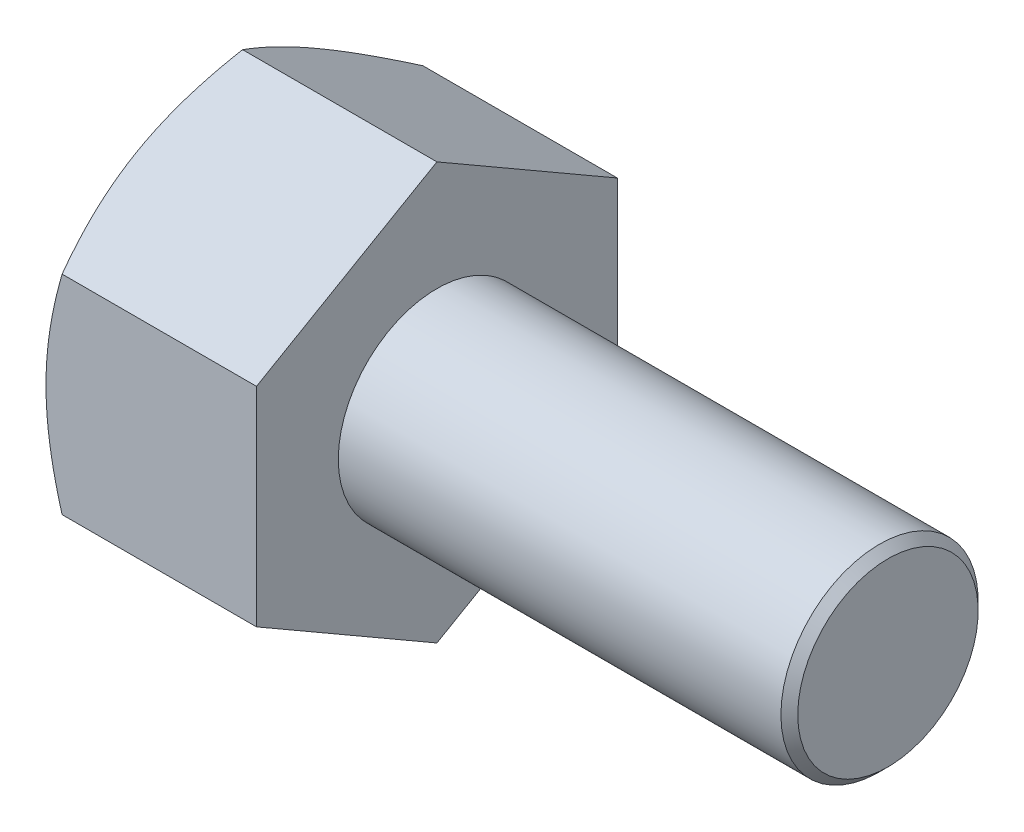
ISO-10303-21;
HEADER;
FILE_DESCRIPTION(('STEP AP214'),'2;1');
FILE_NAME('part.step','',(''),(''),'','','');
FILE_SCHEMA(('AUTOMOTIVE_DESIGN { 1 0 10303 214 1 1 1 1 }'));
ENDSEC;
DATA;
#1=APPLICATION_CONTEXT('core data for automotive mechanical design processes');
#2=APPLICATION_PROTOCOL_DEFINITION('international standard','automotive_design',2000,#1);
#3=PRODUCT_CONTEXT('',#1,'mechanical');
#4=PRODUCT('Part','Part','',(#3));
#5=PRODUCT_RELATED_PRODUCT_CATEGORY('part','',(#4));
#6=PRODUCT_DEFINITION_FORMATION('','',#4);
#7=PRODUCT_DEFINITION_CONTEXT('part definition',#1,'design');
#8=PRODUCT_DEFINITION('design','',#6,#7);
#9=PRODUCT_DEFINITION_SHAPE('','',#8);
#10=(LENGTH_UNIT() NAMED_UNIT(*) SI_UNIT(.MILLI.,.METRE.));
#11=(NAMED_UNIT(*) PLANE_ANGLE_UNIT() SI_UNIT($,.RADIAN.));
#12=(NAMED_UNIT(*) SI_UNIT($,.STERADIAN.) SOLID_ANGLE_UNIT());
#13=UNCERTAINTY_MEASURE_WITH_UNIT(LENGTH_MEASURE(1.E-05),#10,'distance_accuracy_value','');
#14=(GEOMETRIC_REPRESENTATION_CONTEXT(3) GLOBAL_UNCERTAINTY_ASSIGNED_CONTEXT((#13)) GLOBAL_UNIT_ASSIGNED_CONTEXT((#10,
#11,#12)) REPRESENTATION_CONTEXT('',''));
#15=CARTESIAN_POINT('',(0.,0.,0.));
#16=DIRECTION('',(0.,0.,1.));
#17=DIRECTION('',(1.,0.,0.));
#18=AXIS2_PLACEMENT_3D('',#15,#16,#17);
#19=CARTESIAN_POINT('',(17.78,8.79881810244989,-15.24));
#20=DIRECTION('',(0.,-0.866025403784438,0.500000000000001));
#21=DIRECTION('',(0.,-0.500000000000001,-0.866025403784438));
#22=AXIS2_PLACEMENT_3D('',#19,#20,#21);
#23=PLANE('',#22);
#24=CARTESIAN_POINT('',(1.36124856487293,17.5977516749536,0.00019999999999964));
#25=CARTESIAN_POINT('',(1.24959951580787,17.4043571270071,-0.334769182950277));
#26=CARTESIAN_POINT('',(1.14301689339764,17.2102082364175,-0.67104492568457));
#27=CARTESIAN_POINT('',(0.941392794274875,16.8203536097317,-1.34629294667019));
#28=CARTESIAN_POINT('',(0.846355113416604,16.6246473840139,-1.68526607297097));
#29=CARTESIAN_POINT('',(0.66909840053516,16.2312998636243,-2.366563963317));
#30=CARTESIAN_POINT('',(0.586909697644726,16.0336551269014,-2.70889468916957));
#31=CARTESIAN_POINT('',(0.437115772865838,15.6369922624283,-3.39593492391281));
#32=CARTESIAN_POINT('',(0.369509719007362,15.4379742136972,-3.74064429593826));
#33=CARTESIAN_POINT('',(0.251756608946902,15.0436643229984,-4.42360906055556));
#34=CARTESIAN_POINT('',(0.201219810608037,14.8484017549047,-4.76181374931027));
#35=CARTESIAN_POINT('',(0.116480799136285,14.456981889209,-5.43977284378687));
#36=CARTESIAN_POINT('',(0.0822789004151911,14.2608245744585,-5.77952727921101));
#37=CARTESIAN_POINT('',(0.031073266351231,13.8681804292977,-6.45960688792405));
#38=CARTESIAN_POINT('',(0.0140490943081159,13.6716942696884,-6.79993089935137));
#39=CARTESIAN_POINT('',(-0.00243496934619382,13.2785405765824,-7.48089307099431));
#40=CARTESIAN_POINT('',(-0.00189540367909207,13.0818730488777,-7.82153122117776));
#41=CARTESIAN_POINT('',(0.0155211376957889,12.7142046937736,-8.45835149255341));
#42=CARTESIAN_POINT('',(0.030273714378812,12.5431776644535,-8.75457899680348));
#43=CARTESIAN_POINT('',(0.0727834716971236,12.2015170081387,-9.34635261248803));
#44=CARTESIAN_POINT('',(0.100541572179044,12.0308834098283,-9.64189867423982));
#45=CARTESIAN_POINT('',(0.168578399449137,11.6901022976449,-10.2321488748013));
#46=CARTESIAN_POINT('',(0.208867467112933,11.5199553027916,-10.5268521146425));
#47=CARTESIAN_POINT('',(0.301259369306836,11.180458992243,-11.1148769734947));
#48=CARTESIAN_POINT('',(0.353363006957712,11.0111097315748,-11.4081984971963));
#49=CARTESIAN_POINT('',(0.528712881623148,10.4970406660827,-12.2985922372281));
#50=CARTESIAN_POINT('',(0.66944328143029,10.1538095162329,-12.8930860275082));
#51=CARTESIAN_POINT('',(0.988843664620513,9.47246519221091,-14.073209014163));
#52=CARTESIAN_POINT('',(1.16743863641809,9.13434329464646,-14.6588533198962));
#53=CARTESIAN_POINT('',(1.36124856487292,8.79870263239605,-15.2402));
#54=B_SPLINE_CURVE_WITH_KNOTS('',3,(#24,#25,#26,#27,#28,#29,#30,#31,#32,#33,#34,#35,#36,#37,#38,
#39,#40,#41,#42,#43,#44,#45,#46,#47,#48,#49,#50,#51,#52,#53),.UNSPECIFIED.,.F.,.F.,(4,2,2,2,2,2,
2,2,2,2,2,2,2,2,4),(0.,1.20777405446518,2.41594414355609,3.62692432470835,4.83783539867415,
6.01885835042782,7.19990403342507,8.37954293904845,9.55914539371592,10.5860139737634,
11.6129551925018,12.6407461281185,13.6686069509877,15.7695293702068,17.8663280118345),.UNSPECIFIED.);
#55=CARTESIAN_POINT('',(1.3611818975501,17.5976362048998,0.));
#56=VERTEX_POINT('',#55);
#57=CARTESIAN_POINT('',(0.,13.1982271536748,-7.62000000000002));
#58=VERTEX_POINT('',#57);
#59=EDGE_CURVE('E56',#56,#58,#54,.T.);
#60=ORIENTED_EDGE('',*,*,#59,.F.);
#61=DIRECTION('',(-1.,0.,0.));
#62=VECTOR('',#61,1.);
#63=CARTESIAN_POINT('',(17.78,17.5976362048998,0.));
#64=LINE('',#63,#62);
#65=CARTESIAN_POINT('',(17.78,17.5976362048998,0.));
#66=VERTEX_POINT('',#65);
#67=EDGE_CURVE('E159',#66,#56,#64,.T.);
#68=ORIENTED_EDGE('',*,*,#67,.F.);
#69=DIRECTION('',(0.,0.500000000000001,0.866025403784438));
#70=VECTOR('',#69,1.);
#71=CARTESIAN_POINT('',(17.78,8.79881810244989,-15.24));
#72=LINE('',#71,#70);
#73=CARTESIAN_POINT('',(17.78,8.79881810244989,-15.24));
#74=VERTEX_POINT('',#73);
#75=EDGE_CURVE('E267',#74,#66,#72,.T.);
#76=ORIENTED_EDGE('',*,*,#75,.F.);
#77=DIRECTION('',(-1.,0.,0.));
#78=VECTOR('',#77,1.);
#79=CARTESIAN_POINT('',(17.78,8.79881810244989,-15.24));
#80=LINE('',#79,#78);
#81=CARTESIAN_POINT('',(1.36118189755009,8.79881810244989,-15.24));
#82=VERTEX_POINT('',#81);
#83=EDGE_CURVE('E143',#74,#82,#80,.T.);
#84=ORIENTED_EDGE('',*,*,#83,.T.);
#85=EDGE_CURVE('E136',#58,#82,#54,.T.);
#86=ORIENTED_EDGE('',*,*,#85,.F.);
#87=EDGE_LOOP('',(#60,#68,#76,#84,#86));
#88=FACE_BOUND('',#87,.T.);
#89=ADVANCED_FACE('F39',(#88),#23,.F.);
#90=CARTESIAN_POINT('',(17.78,17.5976362048998,0.));
#91=DIRECTION('',(0.,-0.866025403784438,-0.500000000000001));
#92=DIRECTION('',(0.,0.500000000000001,-0.866025403784438));
#93=AXIS2_PLACEMENT_3D('',#90,#91,#92);
#94=PLANE('',#93);
#95=CARTESIAN_POINT('',(1.36124856487292,8.79870263239605,15.2402));
#96=CARTESIAN_POINT('',(1.24959951580786,8.99209718034262,14.9052308170497));
#97=CARTESIAN_POINT('',(1.14301689339763,9.18624607093221,14.5689550743154));
#98=CARTESIAN_POINT('',(0.941392794274865,9.57610069761802,13.8937070533298));
#99=CARTESIAN_POINT('',(0.846355113416594,9.77180692333583,13.554733927029));
#100=CARTESIAN_POINT('',(0.669098400535152,10.1651544437254,12.873436036683));
#101=CARTESIAN_POINT('',(0.586909697644719,10.3627991804483,12.5311053108304));
#102=CARTESIAN_POINT('',(0.437115772865832,10.7594620449214,11.8440650760872));
#103=CARTESIAN_POINT('',(0.369509719007355,10.9584800936525,11.4993557040617));
#104=CARTESIAN_POINT('',(0.251756608946896,11.3527899843513,10.8163909394444));
#105=CARTESIAN_POINT('',(0.201219810608032,11.548052552445,10.4781862506897));
#106=CARTESIAN_POINT('',(0.116480799136281,11.9394724181407,9.80022715621313));
#107=CARTESIAN_POINT('',(0.0822789004151884,12.1356297328912,9.46047272078899));
#108=CARTESIAN_POINT('',(0.0310732663512296,12.528273878052,8.78039311207595));
#109=CARTESIAN_POINT('',(0.0140490943081152,12.7247600376613,8.44006910064864));
#110=CARTESIAN_POINT('',(-0.00243496934619321,13.1179137307673,7.75910692900569));
#111=CARTESIAN_POINT('',(-0.0018954036790909,13.3145812584719,7.41846877882224));
#112=CARTESIAN_POINT('',(0.0155211376957912,13.6822496135761,6.78164850744659));
#113=CARTESIAN_POINT('',(0.0302737143788149,13.8532766428962,6.48542100319652));
#114=CARTESIAN_POINT('',(0.0727834716971268,14.194937299211,5.89364738751197));
#115=CARTESIAN_POINT('',(0.100541572179047,14.3655708975214,5.59810132576018));
#116=CARTESIAN_POINT('',(0.168578399449141,14.7063520097047,5.00785112519872));
#117=CARTESIAN_POINT('',(0.208867467112937,14.8764990045581,4.71314788535752));
#118=CARTESIAN_POINT('',(0.30125936930684,15.2159953151066,4.1251230265053));
#119=CARTESIAN_POINT('',(0.353363006957718,15.3853445757749,3.8318015028037));
#120=CARTESIAN_POINT('',(0.528712881623156,15.899413641267,2.94140776277185));
#121=CARTESIAN_POINT('',(0.669443281430297,16.2426447911167,2.34691397249184));
#122=CARTESIAN_POINT('',(0.988843664620521,16.9239891151388,1.16679098583701));
#123=CARTESIAN_POINT('',(1.1674386364181,17.2621110127032,0.581146680103786));
#124=CARTESIAN_POINT('',(1.36124856487293,17.5977516749536,-0.000199999999999774));
#125=B_SPLINE_CURVE_WITH_KNOTS('',3,(#95,#96,#97,#98,#99,#100,#101,#102,#103,#104,#105,#106,
#107,#108,#109,#110,#111,#112,#113,#114,#115,#116,#117,#118,#119,#120,#121,#122,#123,#124),
.UNSPECIFIED.,.F.,.F.,(4,2,2,2,2,2,2,2,2,2,2,2,2,2,4),(0.,1.20777405446517,2.41594414355609,
3.62692432470835,4.83783539867414,6.01885835042781,7.19990403342506,8.37954293904844,
9.55914539371591,10.5860139737634,11.6129551925018,12.6407461281185,13.6686069509877,
15.7695293702068,17.8663280118345),.UNSPECIFIED.);
#126=CARTESIAN_POINT('',(1.36118189755009,8.79881810244989,15.24));
#127=VERTEX_POINT('',#126);
#128=CARTESIAN_POINT('',(0.,13.1982271536748,7.62000000000002));
#129=VERTEX_POINT('',#128);
#130=EDGE_CURVE('E63',#127,#129,#125,.T.);
#131=ORIENTED_EDGE('',*,*,#130,.F.);
#132=DIRECTION('',(-1.,0.,0.));
#133=VECTOR('',#132,1.);
#134=CARTESIAN_POINT('',(17.78,8.79881810244989,15.24));
#135=LINE('',#134,#133);
#136=CARTESIAN_POINT('',(17.78,8.79881810244989,15.24));
#137=VERTEX_POINT('',#136);
#138=EDGE_CURVE('E156',#137,#127,#135,.T.);
#139=ORIENTED_EDGE('',*,*,#138,.F.);
#140=DIRECTION('',(0.,-0.500000000000001,0.866025403784438));
#141=VECTOR('',#140,1.);
#142=CARTESIAN_POINT('',(17.78,17.5976362048998,0.));
#143=LINE('',#142,#141);
#144=EDGE_CURVE('E264',#66,#137,#143,.T.);
#145=ORIENTED_EDGE('',*,*,#144,.F.);
#146=ORIENTED_EDGE('',*,*,#67,.T.);
#147=EDGE_CURVE('E179',#129,#56,#125,.T.);
#148=ORIENTED_EDGE('',*,*,#147,.F.);
#149=EDGE_LOOP('',(#131,#139,#145,#146,#148));
#150=FACE_BOUND('',#149,.T.);
#151=ADVANCED_FACE('F186',(#150),#94,.F.);
#152=CARTESIAN_POINT('',(17.78,8.79881810244989,15.24));
#153=DIRECTION('',(0.,0.,-1.));
#154=DIRECTION('',(0.,1.,0.));
#155=AXIS2_PLACEMENT_3D('',#152,#153,#154);
#156=PLANE('',#155);
#157=CARTESIAN_POINT('',(7.54121583573932,-23.8481137053548,15.24));
#158=CARTESIAN_POINT('',(7.37887246797034,-23.5144083613289,15.24));
#159=CARTESIAN_POINT('',(7.21732262208858,-23.180317159734,15.24));
#160=CARTESIAN_POINT('',(6.89598927401056,-22.5112825977046,15.24));
#161=CARTESIAN_POINT('',(6.73620578893311,-22.1763392290498,15.24));
#162=CARTESIAN_POINT('',(6.25973307750529,-21.1700239219223,15.24));
#163=CARTESIAN_POINT('',(5.94596815850462,-20.497262238917,15.24));
#164=CARTESIAN_POINT('',(5.32644959576107,-19.1437474879311,15.24));
#165=CARTESIAN_POINT('',(5.02074704983542,-18.4629709769752,15.24));
#166=CARTESIAN_POINT('',(4.42156492765915,-17.0960784076018,15.24));
#167=CARTESIAN_POINT('',(4.12808478804654,-16.4099625970202,15.24));
#168=CARTESIAN_POINT('',(3.54704523898309,-15.0083124648695,15.24));
#169=CARTESIAN_POINT('',(3.26000943032597,-14.2925599758653,15.24));
#170=CARTESIAN_POINT('',(2.70714829791309,-12.8527552619921,15.24));
#171=CARTESIAN_POINT('',(2.44132532472564,-12.128702127477,15.24));
#172=CARTESIAN_POINT('',(1.93771678665587,-10.6724550903116,15.24));
#173=CARTESIAN_POINT('',(1.69987625136169,-9.94028034858989,15.24));
#174=CARTESIAN_POINT('',(1.2597088092994,-8.46536114413835,15.24));
#175=CARTESIAN_POINT('',(1.0573709395248,-7.72262002110246,15.24));
#176=CARTESIAN_POINT('',(0.788265120211822,-6.60251145275184,15.24));
#177=CARTESIAN_POINT('',(0.704485701554928,-6.22920763746195,15.24));
#178=CARTESIAN_POINT('',(0.5493695172405,-5.48001038480869,15.24));
#179=CARTESIAN_POINT('',(0.478032506653924,-5.10411699857253,15.24));
#180=CARTESIAN_POINT('',(0.34904671613382,-4.34998348746228,15.24));
#181=CARTESIAN_POINT('',(0.291397710657888,-3.97174340136104,15.24));
#182=CARTESIAN_POINT('',(0.190929921580547,-3.21330197496525,15.24));
#183=CARTESIAN_POINT('',(0.148110480949931,-2.83310072231856,15.24));
#184=CARTESIAN_POINT('',(0.0787010348745647,-2.07632239771864,15.24));
#185=CARTESIAN_POINT('',(0.0519022545093188,-1.69976459244319,15.24));
#186=CARTESIAN_POINT('',(0.0142634422864696,-0.945853079765706,15.24));
#187=CARTESIAN_POINT('',(0.00342313962182331,-0.568499385978319,15.24));
#188=CARTESIAN_POINT('',(-0.0020399151946333,0.186328453514729,15.24));
#189=CARTESIAN_POINT('',(0.00333733990572469,0.563802599274178,15.24));
#190=CARTESIAN_POINT('',(0.0301756956455167,1.31818322002531,15.24));
#191=CARTESIAN_POINT('',(0.0516375130110782,1.69508966897055,15.24));
#192=CARTESIAN_POINT('',(0.121584644764654,2.59452960272929,15.24));
#193=CARTESIAN_POINT('',(0.177346341925567,3.11650761866056,15.24));
#194=CARTESIAN_POINT('',(0.316732111548602,4.15673223150258,15.24));
#195=CARTESIAN_POINT('',(0.400359795925729,4.67497833579208,15.24));
#196=CARTESIAN_POINT('',(0.592502959516718,5.70719653896196,15.24));
#197=CARTESIAN_POINT('',(0.701037189567416,6.22116511387602,15.24));
#198=CARTESIAN_POINT('',(0.939669674095968,7.24401710058536,15.24));
#199=CARTESIAN_POINT('',(1.06976765302189,7.75290057727237,15.24));
#200=CARTESIAN_POINT('',(1.35146290146942,8.77691433743718,15.24));
#201=CARTESIAN_POINT('',(1.50347636662908,9.29192932869866,15.24));
#202=CARTESIAN_POINT('',(1.82364284043521,10.3168892781136,15.24));
#203=CARTESIAN_POINT('',(1.99179595904239,10.8268342016982,15.24));
#204=CARTESIAN_POINT('',(2.34153412662749,11.841898610664,15.24));
#205=CARTESIAN_POINT('',(2.52311501083238,12.3470195378328,15.24));
#206=CARTESIAN_POINT('',(2.89753010138246,13.3530470845144,15.24));
#207=CARTESIAN_POINT('',(3.09036415351943,13.8539537616698,15.24));
#208=CARTESIAN_POINT('',(3.57044995778618,15.0668269180235,15.24));
#209=CARTESIAN_POINT('',(3.86261812552224,15.7768447896344,15.24));
#210=CARTESIAN_POINT('',(4.46193396306996,17.1905502809558,15.24));
#211=CARTESIAN_POINT('',(4.76908270405866,17.8942374437191,15.24));
#212=CARTESIAN_POINT('',(5.39525783492977,19.2965094990752,15.24));
#213=CARTESIAN_POINT('',(5.71428726322006,19.9950930310443,15.24));
#214=CARTESIAN_POINT('',(6.36174140812544,21.3878595167043,15.24));
#215=CARTESIAN_POINT('',(6.69016588950687,22.0820425800434,15.24));
#216=CARTESIAN_POINT('',(7.35499962947057,23.4676039923026,15.24));
#217=CARTESIAN_POINT('',(7.69141809141598,24.1589779170415,15.24));
#218=CARTESIAN_POINT('',(8.37045229647266,25.5386754703128,15.24));
#219=CARTESIAN_POINT('',(8.71306807087436,26.2269990834224,15.24));
#220=CARTESIAN_POINT('',(9.40335310855801,27.6009795574379,15.24));
#221=CARTESIAN_POINT('',(9.75102162993734,28.2866367914811,15.24));
#222=CARTESIAN_POINT('',(10.4506083138602,29.6557756897151,15.24));
#223=CARTESIAN_POINT('',(10.8025264673147,30.339257358555,15.24));
#224=CARTESIAN_POINT('',(11.8011764354871,32.2664530938687,15.24));
#225=CARTESIAN_POINT('',(12.452039448593,33.5080262896687,15.24));
#226=CARTESIAN_POINT('',(13.7625426878557,35.986585213138,15.24));
#227=CARTESIAN_POINT('',(14.4221832705418,37.2235707518392,15.24));
#228=CARTESIAN_POINT('',(15.7463446552268,39.6905951022976,15.24));
#229=CARTESIAN_POINT('',(16.4108473177063,40.92064365705,15.24));
#230=CARTESIAN_POINT('',(17.4114657937587,42.7635678932465,15.24));
#231=CARTESIAN_POINT('',(17.7456393831214,43.3774996694961,15.24));
#232=CARTESIAN_POINT('',(18.4151445234397,44.6047303468053,15.24));
#233=CARTESIAN_POINT('',(18.7504760726285,45.2180292488287,15.24));
#234=CARTESIAN_POINT('',(19.0863187869814,45.8310481881768,15.24));
#235=B_SPLINE_CURVE_WITH_KNOTS('',3,(#157,#158,#159,#160,#161,#162,#163,#164,#165,#166,#167,
#168,#169,#170,#171,#172,#173,#174,#175,#176,#177,#178,#179,#180,#181,#182,#183,#184,#185,#186,
#187,#188,#189,#190,#191,#192,#193,#194,#195,#196,#197,#198,#199,#200,#201,#202,#203,#204,#205,
#206,#207,#208,#209,#210,#211,#212,#213,#214,#215,#216,#217,#218,#219,#220,#221,#222,#223,#224,
#225,#226,#227,#228,#229,#230,#231,#232,#233,#234),.UNSPECIFIED.,.F.,.F.,(4,2,2,2,2,2,2,2,2,2,2,
2,2,2,2,2,2,2,2,2,2,2,2,2,2,2,2,2,2,2,2,2,2,2,2,2,2,2,4),(0.,1.11329568908611,2.22660215830832,
4.45353370326716,6.69223347834671,8.93082995156327,11.2440598398532,13.5575456994096,
15.8664081133143,18.1745563050313,19.3221510328774,20.469723167749,21.6172763923309,
22.7647787676481,23.896981507063,25.0291650333665,26.16134906596,27.2935835515353,
28.8675614531263,30.4417434489498,32.0171144748588,33.5924653714722,35.203093019626,
36.8137316418887,38.4238727849191,40.0339918684987,42.3370967676368,44.6403665910571,
46.9442295613245,49.2480348977971,51.5546350905218,53.8612469326,56.1675234461138,
58.473795027921,62.6792307575688,66.8848378291129,71.0790130806454,73.1759761416794,
75.2729360044805),.UNSPECIFIED.);
#236=CARTESIAN_POINT('',(1.36118189755009,-8.7988181024499,15.24));
#237=VERTEX_POINT('',#236);
#238=CARTESIAN_POINT('',(0.,0.,15.24));
#239=VERTEX_POINT('',#238);
#240=EDGE_CURVE('E281',#237,#239,#235,.T.);
#241=ORIENTED_EDGE('',*,*,#240,.F.);
#242=DIRECTION('',(-1.,0.,0.));
#243=VECTOR('',#242,1.);
#244=CARTESIAN_POINT('',(17.78,-8.7988181024499,15.24));
#245=LINE('',#244,#243);
#246=CARTESIAN_POINT('',(17.78,-8.7988181024499,15.24));
#247=VERTEX_POINT('',#246);
#248=EDGE_CURVE('E147',#247,#237,#245,.T.);
#249=ORIENTED_EDGE('',*,*,#248,.F.);
#250=DIRECTION('',(0.,-1.,0.));
#251=VECTOR('',#250,1.);
#252=CARTESIAN_POINT('',(17.78,8.79881810244989,15.24));
#253=LINE('',#252,#251);
#254=EDGE_CURVE('E259',#137,#247,#253,.T.);
#255=ORIENTED_EDGE('',*,*,#254,.F.);
#256=ORIENTED_EDGE('',*,*,#138,.T.);
#257=EDGE_CURVE('E207',#239,#127,#235,.T.);
#258=ORIENTED_EDGE('',*,*,#257,.F.);
#259=EDGE_LOOP('',(#241,#249,#255,#256,#258));
#260=FACE_BOUND('',#259,.T.);
#261=ADVANCED_FACE('F290',(#260),#156,.F.);
#262=CARTESIAN_POINT('',(17.78,-17.5976362048998,0.));
#263=DIRECTION('',(0.,0.866025403784438,-0.500000000000001));
#264=DIRECTION('',(0.,0.500000000000001,0.866025403784438));
#265=AXIS2_PLACEMENT_3D('',#262,#263,#264);
#266=PLANE('',#265);
#267=CARTESIAN_POINT('',(1.36124856487294,-17.5977516749537,-0.000199999999999888));
#268=CARTESIAN_POINT('',(1.24959951580788,-17.4043571270071,0.334769182950276));
#269=CARTESIAN_POINT('',(1.14301689339765,-17.2102082364175,0.67104492568457));
#270=CARTESIAN_POINT('',(0.941392794274882,-16.8203536097317,1.34629294667019));
#271=CARTESIAN_POINT('',(0.846355113416611,-16.6246473840139,1.68526607297097));
#272=CARTESIAN_POINT('',(0.669098400535167,-16.2312998636243,2.366563963317));
#273=CARTESIAN_POINT('',(0.586909697644733,-16.0336551269014,2.70889468916957));
#274=CARTESIAN_POINT('',(0.437115772865845,-15.6369922624283,3.39593492391281));
#275=CARTESIAN_POINT('',(0.369509719007368,-15.4379742136972,3.74064429593826));
#276=CARTESIAN_POINT('',(0.251756608946908,-15.0436643229984,4.42360906055557));
#277=CARTESIAN_POINT('',(0.201219810608043,-14.8484017549047,4.76181374931027));
#278=CARTESIAN_POINT('',(0.116480799136291,-14.456981889209,5.43977284378688));
#279=CARTESIAN_POINT('',(0.0822789004151981,-14.2608245744585,5.77952727921101));
#280=CARTESIAN_POINT('',(0.0310732663512384,-13.8681804292977,6.45960688792405));
#281=CARTESIAN_POINT('',(0.0140490943081236,-13.6716942696884,6.79993089935137));
#282=CARTESIAN_POINT('',(-0.002434969346186,-13.2785405765824,7.48089307099432));
#283=CARTESIAN_POINT('',(-0.00189540367908434,-13.0818730488778,7.82153122117777));
#284=CARTESIAN_POINT('',(0.0155211376957962,-12.7142046937736,8.45835149255342));
#285=CARTESIAN_POINT('',(0.0302737143788189,-12.5431776644535,8.75457899680349));
#286=CARTESIAN_POINT('',(0.0727834716971303,-12.2015170081387,9.34635261248804));
#287=CARTESIAN_POINT('',(0.100541572179051,-12.0308834098283,9.64189867423982));
#288=CARTESIAN_POINT('',(0.168578399449144,-11.690102297645,10.2321488748013));
#289=CARTESIAN_POINT('',(0.208867467112939,-11.5199553027916,10.5268521146425));
#290=CARTESIAN_POINT('',(0.301259369306841,-11.1804589922431,11.1148769734947));
#291=CARTESIAN_POINT('',(0.353363006957718,-11.0111097315748,11.4081984971963));
#292=CARTESIAN_POINT('',(0.528712881623154,-10.4970406660827,12.2985922372281));
#293=CARTESIAN_POINT('',(0.669443281430294,-10.153809516233,12.8930860275082));
#294=CARTESIAN_POINT('',(0.988843664620515,-9.47246519221093,14.073209014163));
#295=CARTESIAN_POINT('',(1.16743863641809,-9.13434329464648,14.6588533198962));
#296=CARTESIAN_POINT('',(1.36124856487292,-8.79870263239606,15.2402));
#297=B_SPLINE_CURVE_WITH_KNOTS('',3,(#267,#268,#269,#270,#271,#272,#273,#274,#275,#276,#277,
#278,#279,#280,#281,#282,#283,#284,#285,#286,#287,#288,#289,#290,#291,#292,#293,#294,#295,#296),
.UNSPECIFIED.,.F.,.F.,(4,2,2,2,2,2,2,2,2,2,2,2,2,2,4),(0.,1.20777405446518,2.4159441435561,
3.62692432470835,4.83783539867415,6.01885835042783,7.19990403342508,8.37954293904845,
9.55914539371593,10.5860139737634,11.6129551925018,12.6407461281185,13.6686069509877,
15.7695293702068,17.8663280118345),.UNSPECIFIED.);
#298=CARTESIAN_POINT('',(1.36118189755011,-17.5976362048998,0.));
#299=VERTEX_POINT('',#298);
#300=CARTESIAN_POINT('',(0.,-13.1982271536748,7.62000000000002));
#301=VERTEX_POINT('',#300);
#302=EDGE_CURVE('E189',#299,#301,#297,.T.);
#303=ORIENTED_EDGE('',*,*,#302,.F.);
#304=DIRECTION('',(-1.,0.,0.));
#305=VECTOR('',#304,1.);
#306=CARTESIAN_POINT('',(17.78,-17.5976362048998,0.));
#307=LINE('',#306,#305);
#308=CARTESIAN_POINT('',(17.78,-17.5976362048998,0.));
#309=VERTEX_POINT('',#308);
#310=EDGE_CURVE('E142',#309,#299,#307,.T.);
#311=ORIENTED_EDGE('',*,*,#310,.F.);
#312=DIRECTION('',(0.,-0.500000000000001,-0.866025403784438));
#313=VECTOR('',#312,1.);
#314=CARTESIAN_POINT('',(17.78,-17.5976362048998,0.));
#315=LINE('',#314,#313);
#316=EDGE_CURVE('E255',#247,#309,#315,.T.);
#317=ORIENTED_EDGE('',*,*,#316,.F.);
#318=ORIENTED_EDGE('',*,*,#248,.T.);
#319=EDGE_CURVE('E193',#301,#237,#297,.T.);
#320=ORIENTED_EDGE('',*,*,#319,.F.);
#321=EDGE_LOOP('',(#303,#311,#317,#318,#320));
#322=FACE_BOUND('',#321,.T.);
#323=ADVANCED_FACE('F250',(#322),#266,.F.);
#324=CARTESIAN_POINT('',(17.78,-8.79881810244991,-15.24));
#325=DIRECTION('',(0.,0.866025403784438,0.5));
#326=DIRECTION('',(0.,-0.5,0.866025403784438));
#327=AXIS2_PLACEMENT_3D('',#324,#325,#326);
#328=PLANE('',#327);
#329=CARTESIAN_POINT('',(1.36124856487293,-8.79870263239608,-15.2402));
#330=CARTESIAN_POINT('',(1.24959951580787,-8.99209718034265,-14.9052308170497));
#331=CARTESIAN_POINT('',(1.14301689339764,-9.18624607093223,-14.5689550743154));
#332=CARTESIAN_POINT('',(0.941392794274874,-9.57610069761804,-13.8937070533298));
#333=CARTESIAN_POINT('',(0.846355113416602,-9.77180692333585,-13.554733927029));
#334=CARTESIAN_POINT('',(0.66909840053516,-10.1651544437255,-12.873436036683));
#335=CARTESIAN_POINT('',(0.586909697644727,-10.3627991804483,-12.5311053108304));
#336=CARTESIAN_POINT('',(0.437115772865842,-10.7594620449214,-11.8440650760872));
#337=CARTESIAN_POINT('',(0.369509719007365,-10.9584800936525,-11.4993557040617));
#338=CARTESIAN_POINT('',(0.251756608946906,-11.3527899843513,-10.8163909394444));
#339=CARTESIAN_POINT('',(0.201219810608042,-11.5480525524451,-10.4781862506897));
#340=CARTESIAN_POINT('',(0.116480799136291,-11.9394724181407,-9.80022715621313));
#341=CARTESIAN_POINT('',(0.0822789004151985,-12.1356297328912,-9.46047272078899));
#342=CARTESIAN_POINT('',(0.03107326635124,-12.528273878052,-8.78039311207595));
#343=CARTESIAN_POINT('',(0.0140490943081257,-12.7247600376613,-8.44006910064863));
#344=CARTESIAN_POINT('',(-0.0024349693461826,-13.1179137307673,-7.75910692900569));
#345=CARTESIAN_POINT('',(-0.00189540367908014,-13.314581258472,-7.41846877882223));
#346=CARTESIAN_POINT('',(0.0155211376958019,-13.6822496135761,-6.78164850744658));
#347=CARTESIAN_POINT('',(0.0302737143788255,-13.8532766428963,-6.48542100319651));
#348=CARTESIAN_POINT('',(0.0727834716971377,-14.1949372992111,-5.89364738751196));
#349=CARTESIAN_POINT('',(0.100541572179059,-14.3655708975214,-5.59810132576018));
#350=CARTESIAN_POINT('',(0.168578399449152,-14.7063520097048,-5.00785112519871));
#351=CARTESIAN_POINT('',(0.208867467112948,-14.8764990045581,-4.71314788535751));
#352=CARTESIAN_POINT('',(0.301259369306852,-15.2159953151067,-4.12512302650529));
#353=CARTESIAN_POINT('',(0.35336300695773,-15.3853445757749,-3.8318015028037));
#354=CARTESIAN_POINT('',(0.528712881623168,-15.899413641267,-2.94140776277185));
#355=CARTESIAN_POINT('',(0.669443281430308,-16.2426447911168,-2.34691397249184));
#356=CARTESIAN_POINT('',(0.988843664620531,-16.9239891151388,-1.166790985837));
#357=CARTESIAN_POINT('',(1.16743863641811,-17.2621110127032,-0.581146680103783));
#358=CARTESIAN_POINT('',(1.36124856487294,-17.5977516749537,0.000200000000002471));
#359=B_SPLINE_CURVE_WITH_KNOTS('',3,(#329,#330,#331,#332,#333,#334,#335,#336,#337,#338,#339,
#340,#341,#342,#343,#344,#345,#346,#347,#348,#349,#350,#351,#352,#353,#354,#355,#356,#357,#358),
.UNSPECIFIED.,.F.,.F.,(4,2,2,2,2,2,2,2,2,2,2,2,2,2,4),(0.,1.20777405446518,2.41594414355609,
3.62692432470835,4.83783539867415,6.01885835042782,7.19990403342507,8.37954293904845,
9.55914539371592,10.5860139737634,11.6129551925018,12.6407461281185,13.6686069509877,
15.7695293702068,17.8663280118345),.UNSPECIFIED.);
#360=CARTESIAN_POINT('',(1.3611818975501,-8.79881810244991,-15.24));
#361=VERTEX_POINT('',#360);
#362=CARTESIAN_POINT('',(0.,-13.1982271536748,-7.62000000000001));
#363=VERTEX_POINT('',#362);
#364=EDGE_CURVE('E116',#361,#363,#359,.T.);
#365=ORIENTED_EDGE('',*,*,#364,.F.);
#366=DIRECTION('',(-1.,0.,0.));
#367=VECTOR('',#366,1.);
#368=CARTESIAN_POINT('',(17.78,-8.79881810244991,-15.24));
#369=LINE('',#368,#367);
#370=CARTESIAN_POINT('',(17.78,-8.79881810244991,-15.24));
#371=VERTEX_POINT('',#370);
#372=EDGE_CURVE('E131',#371,#361,#369,.T.);
#373=ORIENTED_EDGE('',*,*,#372,.F.);
#374=DIRECTION('',(0.,0.5,-0.866025403784438));
#375=VECTOR('',#374,1.);
#376=CARTESIAN_POINT('',(17.78,-8.79881810244991,-15.24));
#377=LINE('',#376,#375);
#378=EDGE_CURVE('E252',#309,#371,#377,.T.);
#379=ORIENTED_EDGE('',*,*,#378,.F.);
#380=ORIENTED_EDGE('',*,*,#310,.T.);
#381=EDGE_CURVE('E134',#363,#299,#359,.T.);
#382=ORIENTED_EDGE('',*,*,#381,.F.);
#383=EDGE_LOOP('',(#365,#373,#379,#380,#382));
#384=FACE_BOUND('',#383,.T.);
#385=ADVANCED_FACE('F129',(#384),#328,.F.);
#386=CARTESIAN_POINT('',(17.78,8.79881810244989,-15.24));
#387=DIRECTION('',(0.,0.,1.));
#388=DIRECTION('',(0.,-1.,0.));
#389=AXIS2_PLACEMENT_3D('',#386,#387,#388);
#390=PLANE('',#389);
#391=CARTESIAN_POINT('',(7.54121583813828,-23.8481137102859,-15.24));
#392=CARTESIAN_POINT('',(7.37887247031924,-23.5144083661771,-15.24));
#393=CARTESIAN_POINT('',(7.21732262438745,-23.1803171644993,-15.24));
#394=CARTESIAN_POINT('',(6.89598927620945,-22.5112826023039,-15.24));
#395=CARTESIAN_POINT('',(6.73620579108205,-22.1763392335661,-15.24));
#396=CARTESIAN_POINT('',(6.25973307950454,-21.1700239261894,-15.24));
#397=CARTESIAN_POINT('',(5.94596816040432,-20.4972622430176,-15.24));
#398=CARTESIAN_POINT('',(5.32644959746159,-19.1437474916964,-15.24));
#399=CARTESIAN_POINT('',(5.02074705143633,-18.4629709805715,-15.24));
#400=CARTESIAN_POINT('',(4.42156492906249,-17.096078410859,-15.24));
#401=CARTESIAN_POINT('',(4.12808478935193,-16.4099626001072,-15.24));
#402=CARTESIAN_POINT('',(3.5470452400897,-15.008312467603,-15.24));
#403=CARTESIAN_POINT('',(3.26000943133198,-14.2925599784153,-15.24));
#404=CARTESIAN_POINT('',(2.70714829872329,-12.852755264172,-15.24));
#405=CARTESIAN_POINT('',(2.44132532544061,-12.1287021294704,-15.24));
#406=CARTESIAN_POINT('',(1.93771678718953,-10.6724550919286,-15.24));
#407=CARTESIAN_POINT('',(1.69987625180921,-9.94028035001693,-15.24));
#408=CARTESIAN_POINT('',(1.25970880958873,-8.46536114518028,-15.24));
#409=CARTESIAN_POINT('',(1.05737093974206,-7.72262002194922,-15.24));
#410=CARTESIAN_POINT('',(0.78826512032569,-6.60251145325435,-15.24));
#411=CARTESIAN_POINT('',(0.704485701630893,-6.22920763781729,-15.24));
#412=CARTESIAN_POINT('',(0.549369517250307,-5.48001038486759,-15.24));
#413=CARTESIAN_POINT('',(0.478032506635475,-5.10411699848216,-15.24));
#414=CARTESIAN_POINT('',(0.349046716070017,-4.34998348707173,-15.24));
#415=CARTESIAN_POINT('',(0.291397710576983,-3.97174340081958,-15.24));
#416=CARTESIAN_POINT('',(0.190929921477854,-3.2133019741207,-15.24));
#417=CARTESIAN_POINT('',(0.148110480842552,-2.83310072132181,-15.24));
#418=CARTESIAN_POINT('',(0.0787010347712704,-2.07632239642069,-15.24));
#419=CARTESIAN_POINT('',(0.0519022544145476,-1.69976459099624,-15.24));
#420=CARTESIAN_POINT('',(0.0142634422219042,-0.945853078021068,-15.24));
#421=CARTESIAN_POINT('',(0.00342313957894022,-0.568499384084982,-15.24));
#422=CARTESIAN_POINT('',(-0.00203991518129878,0.186328455704362,-15.24));
#423=CARTESIAN_POINT('',(0.00333733995359745,0.563802601611408,-15.24));
#424=CARTESIAN_POINT('',(0.0301756957744031,1.31818322265579,-15.24));
#425=CARTESIAN_POINT('',(0.0516375131864403,1.69508967174668,-15.24));
#426=CARTESIAN_POINT('',(0.121584645054338,2.59452960573058,-15.24));
#427=CARTESIAN_POINT('',(0.177346342281083,3.11650762174071,-15.24));
#428=CARTESIAN_POINT('',(0.316732112039273,4.15673223473689,-15.24));
#429=CARTESIAN_POINT('',(0.400359796485722,4.67497833910169,-15.24));
#430=CARTESIAN_POINT('',(0.592502960216447,5.70719654241939,-15.24));
#431=CARTESIAN_POINT('',(0.701037190337564,6.22116511740596,-15.24));
#432=CARTESIAN_POINT('',(0.939669675006268,7.24401710425822,-15.24));
#433=CARTESIAN_POINT('',(1.06976765400192,7.75290058101564,-15.24));
#434=CARTESIAN_POINT('',(1.35146290258924,8.77691434132315,-15.24));
#435=CARTESIAN_POINT('',(1.50347636781897,9.2919293326569,-15.24));
#436=CARTESIAN_POINT('',(1.82364284176309,10.3168892822156,-15.24));
#437=CARTESIAN_POINT('',(1.99179596043817,10.8268342058716,-15.24));
#438=CARTESIAN_POINT('',(2.34153412815667,11.8418986149798,-15.24));
#439=CARTESIAN_POINT('',(2.52311501242706,12.3470195422196,-15.24));
#440=CARTESIAN_POINT('',(2.89753010310587,13.3530470890431,-15.24));
#441=CARTESIAN_POINT('',(3.09036415530608,13.8539537662695,-15.24));
#442=CARTESIAN_POINT('',(3.57044995967425,15.0668269226702,-15.24));
#443=CARTESIAN_POINT('',(3.86261812744402,15.7768447942586,-15.24));
#444=CARTESIAN_POINT('',(4.46193396505093,17.1905502855378,-15.24));
#445=CARTESIAN_POINT('',(4.7690827060651,17.8942374482812,-15.24));
#446=CARTESIAN_POINT('',(5.39525783698089,19.2965095035997,-15.24));
#447=CARTESIAN_POINT('',(5.71428726529039,19.9950930355511,-15.24));
#448=CARTESIAN_POINT('',(6.36174141022951,21.3878595211773,-15.24));
#449=CARTESIAN_POINT('',(6.6901658916255,22.0820425845006,-15.24));
#450=CARTESIAN_POINT('',(7.35499963161438,23.4676039967287,-15.24));
#451=CARTESIAN_POINT('',(7.6914180935704,24.1589779214523,-15.24));
#452=CARTESIAN_POINT('',(8.37045229864555,25.5386754746945,-15.24));
#453=CARTESIAN_POINT('',(8.71306807305511,26.2269990877901,-15.24));
#454=CARTESIAN_POINT('',(9.40335311075237,27.6009795617787,-15.24));
#455=CARTESIAN_POINT('',(9.75102163213746,28.286636795809,-15.24));
#456=CARTESIAN_POINT('',(10.4506083160701,29.6557756940181,-15.24));
#457=CARTESIAN_POINT('',(10.8025264695287,30.3392573628458,-15.24));
#458=CARTESIAN_POINT('',(11.8011764377196,32.2664530981435,-15.24));
#459=CARTESIAN_POINT('',(12.4520394508384,33.5080262939402,-15.24));
#460=CARTESIAN_POINT('',(13.7625426901243,35.9865852174041,-15.24));
#461=CARTESIAN_POINT('',(14.4221832728206,37.2235707561034,-15.24));
#462=CARTESIAN_POINT('',(15.7463446575257,39.6905951065619,-15.24));
#463=CARTESIAN_POINT('',(16.410847320015,40.9206436613165,-15.24));
#464=CARTESIAN_POINT('',(17.4114657960812,42.7635678975169,-15.24));
#465=CARTESIAN_POINT('',(17.7456393854483,43.3774996737679,-15.24));
#466=CARTESIAN_POINT('',(18.4151445257753,44.60473035108,-15.24));
#467=CARTESIAN_POINT('',(18.7504760749682,45.218029253105,-15.24));
#468=CARTESIAN_POINT('',(19.0863187893251,45.8310481924547,-15.24));
#469=B_SPLINE_CURVE_WITH_KNOTS('',3,(#391,#392,#393,#394,#395,#396,#397,#398,#399,#400,#401,
#402,#403,#404,#405,#406,#407,#408,#409,#410,#411,#412,#413,#414,#415,#416,#417,#418,#419,#420,
#421,#422,#423,#424,#425,#426,#427,#428,#429,#430,#431,#432,#433,#434,#435,#436,#437,#438,#439,
#440,#441,#442,#443,#444,#445,#446,#447,#448,#449,#450,#451,#452,#453,#454,#455,#456,#457,#458,
#459,#460,#461,#462,#463,#464,#465,#466,#467,#468),.UNSPECIFIED.,.F.,.F.,(4,2,2,2,2,2,2,2,2,2,2,
2,2,2,2,2,2,2,2,2,2,2,2,2,2,2,2,2,2,2,2,2,2,2,2,2,2,2,4),(0.,1.11329568937542,2.22660215888692,
4.45353370442445,6.69223348008885,8.93082995389023,11.2440598428035,13.5575457029834,
15.8664081175096,18.1745563098476,19.3221510381492,20.4697231734763,21.6172763985131,
22.7647787742852,23.8969815141438,25.0291650408909,26.1613490739282,27.2935835599473,
28.8675614617944,30.441743457874,32.0171144840396,33.5924653809095,35.2030930293308,
36.813731651861,38.4238727951583,40.0339918790047,42.3370967781193,44.6403666015158,
46.9442295717586,49.2480349082068,51.5546351009045,53.8612469429557,56.1675234564428,
58.4737950382233,62.6792307678804,66.8848378394336,71.079013090986,73.17597615203,
75.2729360148412),.UNSPECIFIED.);
#470=CARTESIAN_POINT('',(0.,0.,-15.24));
#471=VERTEX_POINT('',#470);
#472=EDGE_CURVE('E123',#82,#471,#469,.F.);
#473=ORIENTED_EDGE('',*,*,#472,.F.);
#474=ORIENTED_EDGE('',*,*,#83,.F.);
#475=DIRECTION('',(0.,1.,0.));
#476=VECTOR('',#475,1.);
#477=CARTESIAN_POINT('',(17.78,8.79881810244989,-15.24));
#478=LINE('',#477,#476);
#479=EDGE_CURVE('E140',#371,#74,#478,.T.);
#480=ORIENTED_EDGE('',*,*,#479,.F.);
#481=ORIENTED_EDGE('',*,*,#372,.T.);
#482=EDGE_CURVE('E113',#471,#361,#469,.F.);
#483=ORIENTED_EDGE('',*,*,#482,.F.);
#484=EDGE_LOOP('',(#473,#474,#480,#481,#483));
#485=FACE_BOUND('',#484,.T.);
#486=ADVANCED_FACE('F138',(#485),#390,.F.);
#487=CARTESIAN_POINT('',(17.78,17.5976362048998,0.));
#488=DIRECTION('',(1.,0.,0.));
#489=DIRECTION('',(0.,0.,-1.));
#490=AXIS2_PLACEMENT_3D('',#487,#488,#489);
#491=PLANE('',#490);
#492=CARTESIAN_POINT('',(17.78,0.,0.));
#493=DIRECTION('',(1.,0.,0.));
#494=DIRECTION('',(0.,0.,-1.));
#495=AXIS2_PLACEMENT_3D('',#492,#493,#494);
#496=CIRCLE('',#495,8.3312);
#497=CARTESIAN_POINT('',(17.78,0.,-8.3312));
#498=VERTEX_POINT('',#497);
#499=EDGE_CURVE('E271',#498,#498,#496,.F.);
#500=ORIENTED_EDGE('',*,*,#499,.T.);
#501=EDGE_LOOP('',(#500));
#502=FACE_BOUND('',#501,.T.);
#503=ORIENTED_EDGE('',*,*,#75,.T.);
#504=ORIENTED_EDGE('',*,*,#144,.T.);
#505=ORIENTED_EDGE('',*,*,#254,.T.);
#506=ORIENTED_EDGE('',*,*,#316,.T.);
#507=ORIENTED_EDGE('',*,*,#378,.T.);
#508=ORIENTED_EDGE('',*,*,#479,.T.);
#509=EDGE_LOOP('',(#503,#504,#505,#506,#507,#508));
#510=FACE_BOUND('',#509,.T.);
#511=ADVANCED_FACE('F292',(#502,#510),#491,.T.);
#512=CARTESIAN_POINT('',(0.,0.,0.));
#513=DIRECTION('',(-1.,0.,0.));
#514=DIRECTION('',(0.,0.,1.));
#515=AXIS2_PLACEMENT_3D('',#512,#513,#514);
#516=CYLINDRICAL_SURFACE('',#515,8.3312);
#517=ORIENTED_EDGE('',*,*,#499,.F.);
#518=EDGE_LOOP('',(#517));
#519=FACE_BOUND('',#518,.T.);
#520=CARTESIAN_POINT('',(55.1688,0.,0.));
#521=DIRECTION('',(-1.,0.,0.));
#522=DIRECTION('',(0.,0.,1.));
#523=AXIS2_PLACEMENT_3D('',#520,#521,#522);
#524=CIRCLE('',#523,8.3312);
#525=CARTESIAN_POINT('',(55.1688,0.,8.3312));
#526=VERTEX_POINT('',#525);
#527=EDGE_CURVE('E275',#526,#526,#524,.T.);
#528=ORIENTED_EDGE('',*,*,#527,.T.);
#529=EDGE_LOOP('',(#528));
#530=FACE_BOUND('',#529,.T.);
#531=ADVANCED_FACE('F324',(#519,#530),#516,.T.);
#532=CARTESIAN_POINT('',(55.88,0.,0.));
#533=DIRECTION('',(-1.,0.,0.));
#534=DIRECTION('',(0.,0.,1.));
#535=AXIS2_PLACEMENT_3D('',#532,#533,#534);
#536=CONICAL_SURFACE('',#535,7.62,0.785398163397453);
#537=ORIENTED_EDGE('',*,*,#527,.F.);
#538=EDGE_LOOP('',(#537));
#539=FACE_BOUND('',#538,.T.);
#540=CARTESIAN_POINT('',(55.88,0.,0.));
#541=DIRECTION('',(-1.,0.,0.));
#542=DIRECTION('',(0.,0.,1.));
#543=AXIS2_PLACEMENT_3D('',#540,#541,#542);
#544=CIRCLE('',#543,7.62);
#545=CARTESIAN_POINT('',(55.88,0.,7.62));
#546=VERTEX_POINT('',#545);
#547=EDGE_CURVE('E278',#546,#546,#544,.T.);
#548=ORIENTED_EDGE('',*,*,#547,.T.);
#549=EDGE_LOOP('',(#548));
#550=FACE_BOUND('',#549,.T.);
#551=ADVANCED_FACE('F327',(#539,#550),#536,.T.);
#552=CARTESIAN_POINT('',(55.88,0.,0.));
#553=DIRECTION('',(-1.,0.,0.));
#554=DIRECTION('',(0.,0.,1.));
#555=AXIS2_PLACEMENT_3D('',#552,#553,#554);
#556=PLANE('',#555);
#557=ORIENTED_EDGE('',*,*,#547,.F.);
#558=EDGE_LOOP('',(#557));
#559=FACE_BOUND('',#558,.T.);
#560=ADVANCED_FACE('F221',(#559),#556,.F.);
#561=CARTESIAN_POINT('',(0.,0.,0.));
#562=DIRECTION('',(1.,0.,0.));
#563=DIRECTION('',(0.,0.,-1.));
#564=AXIS2_PLACEMENT_3D('',#561,#562,#563);
#565=CONICAL_SURFACE('',#564,15.24,1.0471975511966);
#566=ORIENTED_EDGE('',*,*,#364,.T.);
#567=CARTESIAN_POINT('',(0.,0.,0.));
#568=DIRECTION('',(1.,0.,0.));
#569=DIRECTION('',(0.,0.,-1.));
#570=AXIS2_PLACEMENT_3D('',#567,#568,#569);
#571=CIRCLE('',#570,15.24);
#572=EDGE_CURVE('E43',#363,#471,#571,.T.);
#573=ORIENTED_EDGE('',*,*,#572,.T.);
#574=ORIENTED_EDGE('',*,*,#482,.T.);
#575=EDGE_LOOP('',(#566,#573,#574));
#576=FACE_BOUND('',#575,.T.);
#577=ADVANCED_FACE('F115',(#576),#565,.T.);
#578=ORIENTED_EDGE('',*,*,#302,.T.);
#579=EDGE_CURVE('E166',#301,#363,#571,.T.);
#580=ORIENTED_EDGE('',*,*,#579,.T.);
#581=ORIENTED_EDGE('',*,*,#381,.T.);
#582=EDGE_LOOP('',(#578,#580,#581));
#583=FACE_BOUND('',#582,.T.);
#584=ADVANCED_FACE('F220',(#583),#565,.T.);
#585=ORIENTED_EDGE('',*,*,#240,.T.);
#586=EDGE_CURVE('E168',#239,#301,#571,.T.);
#587=ORIENTED_EDGE('',*,*,#586,.T.);
#588=ORIENTED_EDGE('',*,*,#319,.T.);
#589=EDGE_LOOP('',(#585,#587,#588));
#590=FACE_BOUND('',#589,.T.);
#591=ADVANCED_FACE('F215',(#590),#565,.T.);
#592=ORIENTED_EDGE('',*,*,#257,.T.);
#593=ORIENTED_EDGE('',*,*,#130,.T.);
#594=CARTESIAN_POINT('',(0.,0.,0.));
#595=DIRECTION('',(-1.,0.,0.));
#596=DIRECTION('',(0.,0.,1.));
#597=AXIS2_PLACEMENT_3D('',#594,#595,#596);
#598=CIRCLE('',#597,15.24);
#599=EDGE_CURVE('E124',#239,#129,#598,.T.);
#600=ORIENTED_EDGE('',*,*,#599,.F.);
#601=EDGE_LOOP('',(#592,#593,#600));
#602=FACE_BOUND('',#601,.T.);
#603=ADVANCED_FACE('F219',(#602),#565,.T.);
#604=ORIENTED_EDGE('',*,*,#147,.T.);
#605=ORIENTED_EDGE('',*,*,#59,.T.);
#606=EDGE_CURVE('E49',#58,#129,#571,.T.);
#607=ORIENTED_EDGE('',*,*,#606,.T.);
#608=EDGE_LOOP('',(#604,#605,#607));
#609=FACE_BOUND('',#608,.T.);
#610=ADVANCED_FACE('F178',(#609),#565,.T.);
#611=ORIENTED_EDGE('',*,*,#85,.T.);
#612=ORIENTED_EDGE('',*,*,#472,.T.);
#613=EDGE_CURVE('E11',#471,#58,#571,.T.);
#614=ORIENTED_EDGE('',*,*,#613,.T.);
#615=EDGE_LOOP('',(#611,#612,#614));
#616=FACE_BOUND('',#615,.T.);
#617=ADVANCED_FACE('F296',(#616),#565,.T.);
#618=CARTESIAN_POINT('',(0.,17.5976362048998,0.));
#619=DIRECTION('',(1.,0.,0.));
#620=DIRECTION('',(0.,0.,-1.));
#621=AXIS2_PLACEMENT_3D('',#618,#619,#620);
#622=PLANE('',#621);
#623=ORIENTED_EDGE('',*,*,#613,.F.);
#624=ORIENTED_EDGE('',*,*,#572,.F.);
#625=ORIENTED_EDGE('',*,*,#579,.F.);
#626=ORIENTED_EDGE('',*,*,#586,.F.);
#627=ORIENTED_EDGE('',*,*,#599,.T.);
#628=ORIENTED_EDGE('',*,*,#606,.F.);
#629=EDGE_LOOP('',(#623,#624,#625,#626,#627,#628));
#630=FACE_BOUND('',#629,.T.);
#631=ADVANCED_FACE('F182',(#630),#622,.F.);
#632=CLOSED_SHELL('',(#89,#151,#261,#323,#385,#486,#511,#531,#551,#560,#577,#584,#591,#603,#610,
#617,#631));
#633=MANIFOLD_SOLID_BREP('B2',#632);
#634=ADVANCED_BREP_SHAPE_REPRESENTATION('',(#18,#633),#14);
#635=SHAPE_DEFINITION_REPRESENTATION(#9,#634);
ENDSEC;
END-ISO-10303-21;
